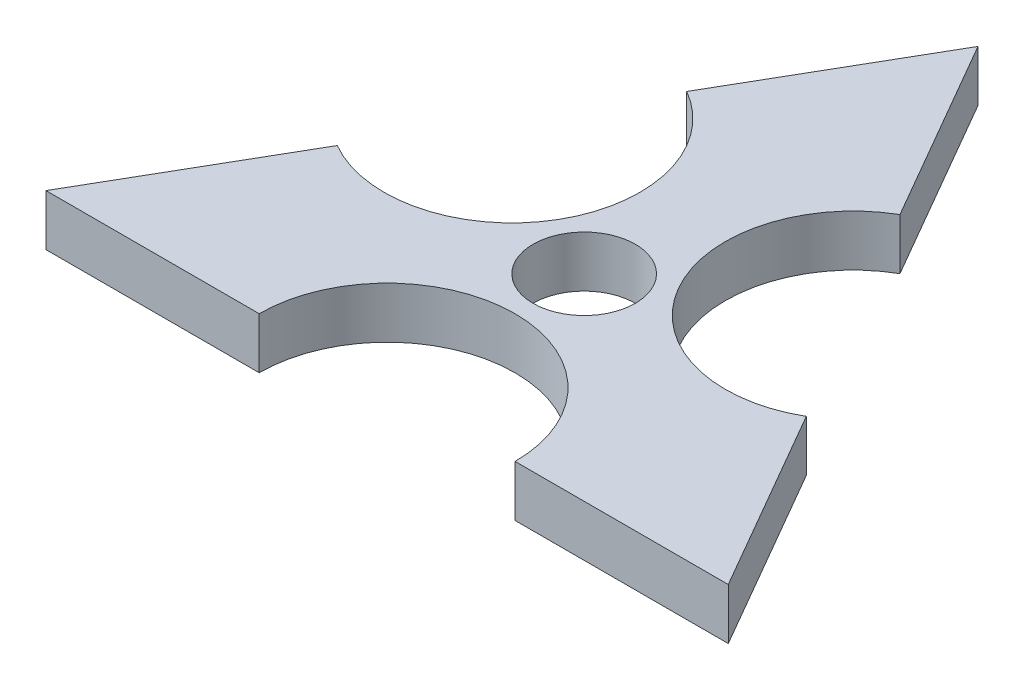
ISO-10303-21;
HEADER;
FILE_DESCRIPTION(('STEP AP214'),'2;1');
FILE_NAME('part.step','',(''),(''),'','','');
FILE_SCHEMA(('AUTOMOTIVE_DESIGN { 1 0 10303 214 1 1 1 1 }'));
ENDSEC;
DATA;
#1=APPLICATION_CONTEXT('core data for automotive mechanical design processes');
#2=APPLICATION_PROTOCOL_DEFINITION('international standard','automotive_design',2000,#1);
#3=PRODUCT_CONTEXT('',#1,'mechanical');
#4=PRODUCT('Part','Part','',(#3));
#5=PRODUCT_RELATED_PRODUCT_CATEGORY('part','',(#4));
#6=PRODUCT_DEFINITION_FORMATION('','',#4);
#7=PRODUCT_DEFINITION_CONTEXT('part definition',#1,'design');
#8=PRODUCT_DEFINITION('design','',#6,#7);
#9=PRODUCT_DEFINITION_SHAPE('','',#8);
#10=(LENGTH_UNIT() NAMED_UNIT(*) SI_UNIT(.MILLI.,.METRE.));
#11=(NAMED_UNIT(*) PLANE_ANGLE_UNIT() SI_UNIT($,.RADIAN.));
#12=(NAMED_UNIT(*) SI_UNIT($,.STERADIAN.) SOLID_ANGLE_UNIT());
#13=UNCERTAINTY_MEASURE_WITH_UNIT(LENGTH_MEASURE(1.E-05),#10,'distance_accuracy_value','');
#14=(GEOMETRIC_REPRESENTATION_CONTEXT(3) GLOBAL_UNCERTAINTY_ASSIGNED_CONTEXT((#13)) GLOBAL_UNIT_ASSIGNED_CONTEXT((#10,
#11,#12)) REPRESENTATION_CONTEXT('',''));
#15=CARTESIAN_POINT('',(0.,0.,0.));
#16=DIRECTION('',(0.,0.,1.));
#17=DIRECTION('',(1.,0.,0.));
#18=AXIS2_PLACEMENT_3D('',#15,#16,#17);
#19=CARTESIAN_POINT('',(0.305052506624473,3.,0.));
#20=DIRECTION('',(0.,-1.,0.));
#21=DIRECTION('',(0.,0.,-1.));
#22=AXIS2_PLACEMENT_3D('',#19,#20,#21);
#23=CYLINDRICAL_SURFACE('',#22,7.5);
#24=CARTESIAN_POINT('',(0.305052506624473,0.,0.));
#25=DIRECTION('',(0.,1.,0.));
#26=DIRECTION('',(0.,0.,1.));
#27=AXIS2_PLACEMENT_3D('',#24,#25,#26);
#28=CIRCLE('',#27,7.5);
#29=CARTESIAN_POINT('',(7.80505250662447,0.,0.));
#30=VERTEX_POINT('',#29);
#31=CARTESIAN_POINT('',(-7.19494749337553,0.,0.));
#32=VERTEX_POINT('',#31);
#33=EDGE_CURVE('E140',#30,#32,#28,.T.);
#34=ORIENTED_EDGE('',*,*,#33,.F.);
#35=DIRECTION('',(0.,-1.,0.));
#36=VECTOR('',#35,1.);
#37=CARTESIAN_POINT('',(7.80505250662447,3.,0.));
#38=LINE('',#37,#36);
#39=CARTESIAN_POINT('',(7.80505250662447,3.,0.));
#40=VERTEX_POINT('',#39);
#41=EDGE_CURVE('E11',#40,#30,#38,.T.);
#42=ORIENTED_EDGE('',*,*,#41,.F.);
#43=CARTESIAN_POINT('',(0.305052506624473,3.,0.));
#44=DIRECTION('',(0.,1.,0.));
#45=DIRECTION('',(0.,0.,1.));
#46=AXIS2_PLACEMENT_3D('',#43,#44,#45);
#47=CIRCLE('',#46,7.5);
#48=CARTESIAN_POINT('',(-7.19494749337553,3.,0.));
#49=VERTEX_POINT('',#48);
#50=EDGE_CURVE('E210',#40,#49,#47,.T.);
#51=ORIENTED_EDGE('',*,*,#50,.T.);
#52=DIRECTION('',(0.,-1.,0.));
#53=VECTOR('',#52,1.);
#54=CARTESIAN_POINT('',(-7.19494749337553,3.,0.));
#55=LINE('',#54,#53);
#56=EDGE_CURVE('E90',#49,#32,#55,.T.);
#57=ORIENTED_EDGE('',*,*,#56,.T.);
#58=EDGE_LOOP('',(#34,#42,#51,#57));
#59=FACE_BOUND('',#58,.T.);
#60=ADVANCED_FACE('F35',(#59),#23,.F.);
#61=CARTESIAN_POINT('',(0.,3.,0.));
#62=DIRECTION('',(0.,0.,-1.));
#63=DIRECTION('',(-1.,0.,0.));
#64=AXIS2_PLACEMENT_3D('',#61,#62,#63);
#65=PLANE('',#64);
#66=DIRECTION('',(1.,0.,0.));
#67=VECTOR('',#66,1.);
#68=CARTESIAN_POINT('',(0.,0.,0.));
#69=LINE('',#68,#67);
#70=CARTESIAN_POINT('',(20.3050525066245,0.,0.));
#71=VERTEX_POINT('',#70);
#72=EDGE_CURVE('E142',#30,#71,#69,.T.);
#73=ORIENTED_EDGE('',*,*,#72,.T.);
#74=DIRECTION('',(0.,-1.,0.));
#75=VECTOR('',#74,1.);
#76=CARTESIAN_POINT('',(20.3050525066245,3.,0.));
#77=LINE('',#76,#75);
#78=CARTESIAN_POINT('',(20.3050525066245,3.,0.));
#79=VERTEX_POINT('',#78);
#80=EDGE_CURVE('E44',#79,#71,#77,.T.);
#81=ORIENTED_EDGE('',*,*,#80,.F.);
#82=DIRECTION('',(1.,0.,0.));
#83=VECTOR('',#82,1.);
#84=CARTESIAN_POINT('',(0.,3.,0.));
#85=LINE('',#84,#83);
#86=EDGE_CURVE('E212',#40,#79,#85,.T.);
#87=ORIENTED_EDGE('',*,*,#86,.F.);
#88=ORIENTED_EDGE('',*,*,#41,.T.);
#89=EDGE_LOOP('',(#73,#81,#87,#88));
#90=FACE_BOUND('',#89,.T.);
#91=ADVANCED_FACE('F175',(#90),#65,.F.);
#92=CARTESIAN_POINT('',(15.2287893799683,3.,-8.79234564795684));
#93=DIRECTION('',(-0.866025403784439,0.,0.5));
#94=DIRECTION('',(0.5,0.,0.866025403784439));
#95=AXIS2_PLACEMENT_3D('',#92,#93,#94);
#96=PLANE('',#95);
#97=DIRECTION('',(-0.5,0.,-0.866025403784439));
#98=VECTOR('',#97,1.);
#99=CARTESIAN_POINT('',(15.2287893799683,0.,-8.79234564795684));
#100=LINE('',#99,#98);
#101=CARTESIAN_POINT('',(14.0550525066245,0.,-10.8253175473055));
#102=VERTEX_POINT('',#101);
#103=EDGE_CURVE('E145',#71,#102,#100,.T.);
#104=ORIENTED_EDGE('',*,*,#103,.T.);
#105=DIRECTION('',(0.,-1.,0.));
#106=VECTOR('',#105,1.);
#107=CARTESIAN_POINT('',(14.0550525066245,3.,-10.8253175473055));
#108=LINE('',#107,#106);
#109=CARTESIAN_POINT('',(14.0550525066245,3.,-10.8253175473055));
#110=VERTEX_POINT('',#109);
#111=EDGE_CURVE('E165',#110,#102,#108,.T.);
#112=ORIENTED_EDGE('',*,*,#111,.F.);
#113=DIRECTION('',(-0.5,0.,-0.866025403784439));
#114=VECTOR('',#113,1.);
#115=CARTESIAN_POINT('',(15.2287893799683,3.,-8.79234564795684));
#116=LINE('',#115,#114);
#117=EDGE_CURVE('E171',#79,#110,#116,.T.);
#118=ORIENTED_EDGE('',*,*,#117,.F.);
#119=ORIENTED_EDGE('',*,*,#80,.T.);
#120=EDGE_LOOP('',(#104,#112,#118,#119));
#121=FACE_BOUND('',#120,.T.);
#122=ADVANCED_FACE('F169',(#121),#96,.F.);
#123=CARTESIAN_POINT('',(10.3050525066245,3.,-17.3205080756888));
#124=DIRECTION('',(0.,-1.,0.));
#125=DIRECTION('',(0.,0.,-1.));
#126=AXIS2_PLACEMENT_3D('',#123,#124,#125);
#127=CYLINDRICAL_SURFACE('',#126,7.5);
#128=CARTESIAN_POINT('',(10.3050525066245,0.,-17.3205080756888));
#129=DIRECTION('',(0.,1.,0.));
#130=DIRECTION('',(0.,0.,1.));
#131=AXIS2_PLACEMENT_3D('',#128,#129,#130);
#132=CIRCLE('',#131,7.5);
#133=CARTESIAN_POINT('',(6.55505250662447,0.,-23.8156986040721));
#134=VERTEX_POINT('',#133);
#135=EDGE_CURVE('E148',#134,#102,#132,.T.);
#136=ORIENTED_EDGE('',*,*,#135,.F.);
#137=DIRECTION('',(0.,-1.,0.));
#138=VECTOR('',#137,1.);
#139=CARTESIAN_POINT('',(6.55505250662447,3.,-23.8156986040721));
#140=LINE('',#139,#138);
#141=CARTESIAN_POINT('',(6.55505250662447,3.,-23.8156986040721));
#142=VERTEX_POINT('',#141);
#143=EDGE_CURVE('E163',#142,#134,#140,.T.);
#144=ORIENTED_EDGE('',*,*,#143,.F.);
#145=CARTESIAN_POINT('',(10.3050525066245,3.,-17.3205080756888));
#146=DIRECTION('',(0.,1.,0.));
#147=DIRECTION('',(0.,0.,1.));
#148=AXIS2_PLACEMENT_3D('',#145,#146,#147);
#149=CIRCLE('',#148,7.5);
#150=EDGE_CURVE('E216',#142,#110,#149,.T.);
#151=ORIENTED_EDGE('',*,*,#150,.T.);
#152=ORIENTED_EDGE('',*,*,#111,.T.);
#153=EDGE_LOOP('',(#136,#144,#151,#152));
#154=FACE_BOUND('',#153,.T.);
#155=ADVANCED_FACE('F184',(#154),#127,.F.);
#156=CARTESIAN_POINT('',(0.305052506624477,0.,-34.6410161513775));
#157=VERTEX_POINT('',#156);
#158=EDGE_CURVE('E149',#134,#157,#100,.T.);
#159=ORIENTED_EDGE('',*,*,#158,.T.);
#160=DIRECTION('',(0.,-1.,0.));
#161=VECTOR('',#160,1.);
#162=CARTESIAN_POINT('',(0.305052506624477,3.,-34.6410161513775));
#163=LINE('',#162,#161);
#164=CARTESIAN_POINT('',(0.305052506624477,3.,-34.6410161513775));
#165=VERTEX_POINT('',#164);
#166=EDGE_CURVE('E160',#165,#157,#163,.T.);
#167=ORIENTED_EDGE('',*,*,#166,.F.);
#168=EDGE_CURVE('E134',#142,#165,#116,.T.);
#169=ORIENTED_EDGE('',*,*,#168,.F.);
#170=ORIENTED_EDGE('',*,*,#143,.T.);
#171=EDGE_LOOP('',(#159,#167,#169,#170));
#172=FACE_BOUND('',#171,.T.);
#173=ADVANCED_FACE('F187',(#172),#96,.F.);
#174=CARTESIAN_POINT('',(-14.7712106200316,3.,-8.52816242773193));
#175=DIRECTION('',(0.866025403784439,0.,0.5));
#176=DIRECTION('',(0.5,0.,-0.866025403784439));
#177=AXIS2_PLACEMENT_3D('',#174,#175,#176);
#178=PLANE('',#177);
#179=DIRECTION('',(-0.5,0.,0.866025403784439));
#180=VECTOR('',#179,1.);
#181=CARTESIAN_POINT('',(-14.7712106200316,0.,-8.52816242773193));
#182=LINE('',#181,#180);
#183=CARTESIAN_POINT('',(-5.94494749337552,0.,-23.8156986040721));
#184=VERTEX_POINT('',#183);
#185=EDGE_CURVE('E152',#157,#184,#182,.T.);
#186=ORIENTED_EDGE('',*,*,#185,.T.);
#187=DIRECTION('',(0.,-1.,0.));
#188=VECTOR('',#187,1.);
#189=CARTESIAN_POINT('',(-5.94494749337552,3.,-23.8156986040721));
#190=LINE('',#189,#188);
#191=CARTESIAN_POINT('',(-5.94494749337552,3.,-23.8156986040721));
#192=VERTEX_POINT('',#191);
#193=EDGE_CURVE('E122',#192,#184,#190,.T.);
#194=ORIENTED_EDGE('',*,*,#193,.F.);
#195=DIRECTION('',(-0.5,0.,0.866025403784439));
#196=VECTOR('',#195,1.);
#197=CARTESIAN_POINT('',(-14.7712106200316,3.,-8.52816242773193));
#198=LINE('',#197,#196);
#199=EDGE_CURVE('E129',#165,#192,#198,.T.);
#200=ORIENTED_EDGE('',*,*,#199,.F.);
#201=ORIENTED_EDGE('',*,*,#166,.T.);
#202=EDGE_LOOP('',(#186,#194,#200,#201));
#203=FACE_BOUND('',#202,.T.);
#204=ADVANCED_FACE('F191',(#203),#178,.F.);
#205=CARTESIAN_POINT('',(-9.69494749337552,3.,-17.3205080756888));
#206=DIRECTION('',(0.,-1.,0.));
#207=DIRECTION('',(0.,0.,-1.));
#208=AXIS2_PLACEMENT_3D('',#205,#206,#207);
#209=CYLINDRICAL_SURFACE('',#208,7.5);
#210=CARTESIAN_POINT('',(-9.69494749337552,0.,-17.3205080756888));
#211=DIRECTION('',(0.,1.,0.));
#212=DIRECTION('',(0.,0.,1.));
#213=AXIS2_PLACEMENT_3D('',#210,#211,#212);
#214=CIRCLE('',#213,7.5);
#215=CARTESIAN_POINT('',(-13.4449474933755,0.,-10.8253175473055));
#216=VERTEX_POINT('',#215);
#217=EDGE_CURVE('E119',#216,#184,#214,.T.);
#218=ORIENTED_EDGE('',*,*,#217,.F.);
#219=DIRECTION('',(0.,-1.,0.));
#220=VECTOR('',#219,1.);
#221=CARTESIAN_POINT('',(-13.4449474933755,3.,-10.8253175473055));
#222=LINE('',#221,#220);
#223=CARTESIAN_POINT('',(-13.4449474933755,3.,-10.8253175473055));
#224=VERTEX_POINT('',#223);
#225=EDGE_CURVE('E113',#224,#216,#222,.T.);
#226=ORIENTED_EDGE('',*,*,#225,.F.);
#227=CARTESIAN_POINT('',(-9.69494749337552,3.,-17.3205080756888));
#228=DIRECTION('',(0.,1.,0.));
#229=DIRECTION('',(0.,0.,1.));
#230=AXIS2_PLACEMENT_3D('',#227,#228,#229);
#231=CIRCLE('',#230,7.5);
#232=EDGE_CURVE('E117',#224,#192,#231,.T.);
#233=ORIENTED_EDGE('',*,*,#232,.T.);
#234=ORIENTED_EDGE('',*,*,#193,.T.);
#235=EDGE_LOOP('',(#218,#226,#233,#234));
#236=FACE_BOUND('',#235,.T.);
#237=ADVANCED_FACE('F115',(#236),#209,.F.);
#238=CARTESIAN_POINT('',(-19.6949474933755,0.,0.));
#239=VERTEX_POINT('',#238);
#240=EDGE_CURVE('E155',#216,#239,#182,.T.);
#241=ORIENTED_EDGE('',*,*,#240,.T.);
#242=DIRECTION('',(0.,-1.,0.));
#243=VECTOR('',#242,1.);
#244=CARTESIAN_POINT('',(-19.6949474933755,3.,0.));
#245=LINE('',#244,#243);
#246=CARTESIAN_POINT('',(-19.6949474933755,3.,0.));
#247=VERTEX_POINT('',#246);
#248=EDGE_CURVE('E123',#247,#239,#245,.T.);
#249=ORIENTED_EDGE('',*,*,#248,.F.);
#250=EDGE_CURVE('E126',#224,#247,#198,.T.);
#251=ORIENTED_EDGE('',*,*,#250,.F.);
#252=ORIENTED_EDGE('',*,*,#225,.T.);
#253=EDGE_LOOP('',(#241,#249,#251,#252));
#254=FACE_BOUND('',#253,.T.);
#255=ADVANCED_FACE('F127',(#254),#178,.F.);
#256=CARTESIAN_POINT('',(0.305052506624474,3.,-11.5519651643339));
#257=DIRECTION('',(0.,-1.,0.));
#258=DIRECTION('',(0.,0.,-1.));
#259=AXIS2_PLACEMENT_3D('',#256,#257,#258);
#260=CYLINDRICAL_SURFACE('',#259,3.);
#261=CARTESIAN_POINT('',(0.305052506624474,3.,-11.5519651643339));
#262=DIRECTION('',(0.,1.,0.));
#263=DIRECTION('',(0.,0.,1.));
#264=AXIS2_PLACEMENT_3D('',#261,#262,#263);
#265=CIRCLE('',#264,3.);
#266=CARTESIAN_POINT('',(0.305052506624474,3.,-8.5519651643339));
#267=VERTEX_POINT('',#266);
#268=EDGE_CURVE('E208',#267,#267,#265,.T.);
#269=ORIENTED_EDGE('',*,*,#268,.T.);
#270=EDGE_LOOP('',(#269));
#271=FACE_BOUND('',#270,.T.);
#272=CARTESIAN_POINT('',(0.305052506624474,0.,-11.5519651643339));
#273=DIRECTION('',(0.,1.,0.));
#274=DIRECTION('',(0.,0.,1.));
#275=AXIS2_PLACEMENT_3D('',#272,#273,#274);
#276=CIRCLE('',#275,3.);
#277=CARTESIAN_POINT('',(0.305052506624474,0.,-8.5519651643339));
#278=VERTEX_POINT('',#277);
#279=EDGE_CURVE('E137',#278,#278,#276,.T.);
#280=ORIENTED_EDGE('',*,*,#279,.F.);
#281=EDGE_LOOP('',(#280));
#282=FACE_BOUND('',#281,.T.);
#283=ADVANCED_FACE('F37',(#271,#282),#260,.F.);
#284=EDGE_CURVE('E83',#239,#32,#69,.T.);
#285=ORIENTED_EDGE('',*,*,#284,.T.);
#286=ORIENTED_EDGE('',*,*,#56,.F.);
#287=EDGE_CURVE('E52',#247,#49,#85,.T.);
#288=ORIENTED_EDGE('',*,*,#287,.F.);
#289=ORIENTED_EDGE('',*,*,#248,.T.);
#290=EDGE_LOOP('',(#285,#286,#288,#289));
#291=FACE_BOUND('',#290,.T.);
#292=ADVANCED_FACE('F182',(#291),#65,.F.);
#293=CARTESIAN_POINT('',(0.,3.,0.));
#294=DIRECTION('',(0.,1.,0.));
#295=DIRECTION('',(0.,0.,1.));
#296=AXIS2_PLACEMENT_3D('',#293,#294,#295);
#297=PLANE('',#296);
#298=ORIENTED_EDGE('',*,*,#268,.F.);
#299=EDGE_LOOP('',(#298));
#300=FACE_BOUND('',#299,.T.);
#301=ORIENTED_EDGE('',*,*,#50,.F.);
#302=ORIENTED_EDGE('',*,*,#86,.T.);
#303=ORIENTED_EDGE('',*,*,#117,.T.);
#304=ORIENTED_EDGE('',*,*,#150,.F.);
#305=ORIENTED_EDGE('',*,*,#168,.T.);
#306=ORIENTED_EDGE('',*,*,#199,.T.);
#307=ORIENTED_EDGE('',*,*,#232,.F.);
#308=ORIENTED_EDGE('',*,*,#250,.T.);
#309=ORIENTED_EDGE('',*,*,#287,.T.);
#310=EDGE_LOOP('',(#301,#302,#303,#304,#305,#306,#307,#308,#309));
#311=FACE_BOUND('',#310,.T.);
#312=ADVANCED_FACE('F130',(#300,#311),#297,.T.);
#313=CARTESIAN_POINT('',(0.,0.,0.));
#314=DIRECTION('',(0.,1.,0.));
#315=DIRECTION('',(0.,0.,1.));
#316=AXIS2_PLACEMENT_3D('',#313,#314,#315);
#317=PLANE('',#316);
#318=ORIENTED_EDGE('',*,*,#279,.T.);
#319=EDGE_LOOP('',(#318));
#320=FACE_BOUND('',#319,.T.);
#321=ORIENTED_EDGE('',*,*,#33,.T.);
#322=ORIENTED_EDGE('',*,*,#284,.F.);
#323=ORIENTED_EDGE('',*,*,#240,.F.);
#324=ORIENTED_EDGE('',*,*,#217,.T.);
#325=ORIENTED_EDGE('',*,*,#185,.F.);
#326=ORIENTED_EDGE('',*,*,#158,.F.);
#327=ORIENTED_EDGE('',*,*,#135,.T.);
#328=ORIENTED_EDGE('',*,*,#103,.F.);
#329=ORIENTED_EDGE('',*,*,#72,.F.);
#330=EDGE_LOOP('',(#321,#322,#323,#324,#325,#326,#327,#328,#329));
#331=FACE_BOUND('',#330,.T.);
#332=ADVANCED_FACE('F176',(#320,#331),#317,.F.);
#333=CLOSED_SHELL('',(#60,#91,#122,#155,#173,#204,#237,#255,#283,#292,#312,#332));
#334=MANIFOLD_SOLID_BREP('B2',#333);
#335=ADVANCED_BREP_SHAPE_REPRESENTATION('',(#18,#334),#14);
#336=SHAPE_DEFINITION_REPRESENTATION(#9,#335);
ENDSEC;
END-ISO-10303-21;
